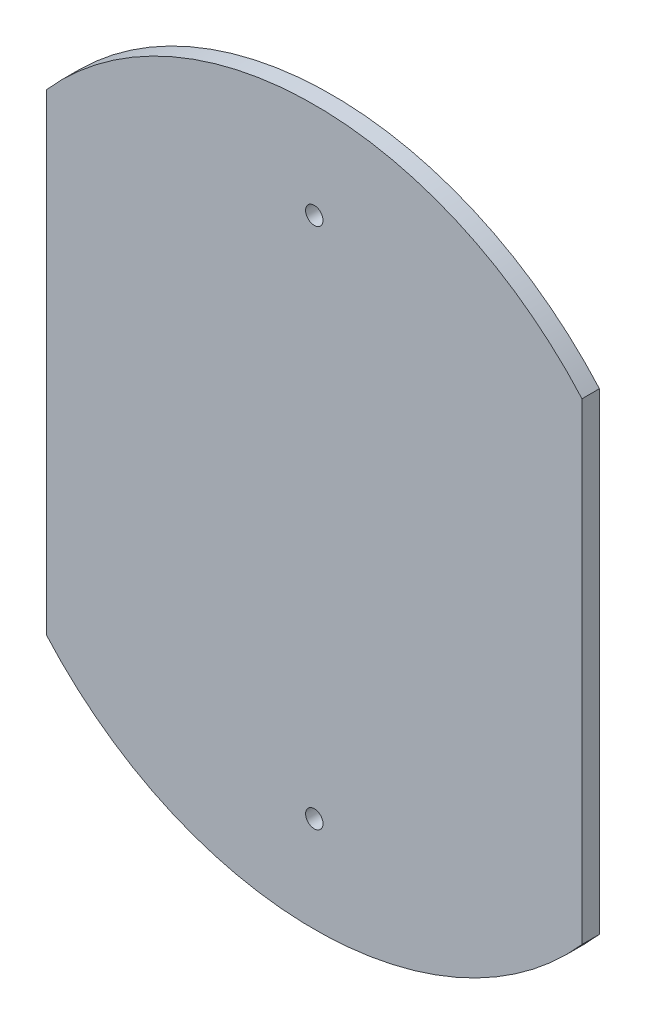
ISO-10303-21;
HEADER;
FILE_DESCRIPTION(('STEP AP214'),'2;1');
FILE_NAME('part.step','',(''),(''),'','','');
FILE_SCHEMA(('AUTOMOTIVE_DESIGN { 1 0 10303 214 1 1 1 1 }'));
ENDSEC;
DATA;
#1=APPLICATION_CONTEXT('core data for automotive mechanical design processes');
#2=APPLICATION_PROTOCOL_DEFINITION('international standard','automotive_design',2000,#1);
#3=PRODUCT_CONTEXT('',#1,'mechanical');
#4=PRODUCT('Part','Part','',(#3));
#5=PRODUCT_RELATED_PRODUCT_CATEGORY('part','',(#4));
#6=PRODUCT_DEFINITION_FORMATION('','',#4);
#7=PRODUCT_DEFINITION_CONTEXT('part definition',#1,'design');
#8=PRODUCT_DEFINITION('design','',#6,#7);
#9=PRODUCT_DEFINITION_SHAPE('','',#8);
#10=(LENGTH_UNIT() NAMED_UNIT(*) SI_UNIT(.MILLI.,.METRE.));
#11=(NAMED_UNIT(*) PLANE_ANGLE_UNIT() SI_UNIT($,.RADIAN.));
#12=(NAMED_UNIT(*) SI_UNIT($,.STERADIAN.) SOLID_ANGLE_UNIT());
#13=UNCERTAINTY_MEASURE_WITH_UNIT(LENGTH_MEASURE(1.E-05),#10,'distance_accuracy_value','');
#14=(GEOMETRIC_REPRESENTATION_CONTEXT(3) GLOBAL_UNCERTAINTY_ASSIGNED_CONTEXT((#13)) GLOBAL_UNIT_ASSIGNED_CONTEXT((#10,
#11,#12)) REPRESENTATION_CONTEXT('',''));
#15=CARTESIAN_POINT('',(0.,0.,0.));
#16=DIRECTION('',(0.,0.,1.));
#17=DIRECTION('',(1.,0.,0.));
#18=AXIS2_PLACEMENT_3D('',#15,#16,#17);
#19=CARTESIAN_POINT('',(0.,0.,4.));
#20=DIRECTION('',(0.,0.,-1.));
#21=DIRECTION('',(-1.,0.,0.));
#22=AXIS2_PLACEMENT_3D('',#19,#20,#21);
#23=CYLINDRICAL_SURFACE('',#22,82.);
#24=CARTESIAN_POINT('',(0.,0.,4.));
#25=DIRECTION('',(0.,0.,1.));
#26=DIRECTION('',(1.,0.,0.));
#27=AXIS2_PLACEMENT_3D('',#24,#25,#26);
#28=CIRCLE('',#27,82.);
#29=CARTESIAN_POINT('',(-61.4794501689973,-54.2611943005107,4.));
#30=VERTEX_POINT('',#29);
#31=CARTESIAN_POINT('',(61.4794501689973,-54.2611943005107,4.));
#32=VERTEX_POINT('',#31);
#33=EDGE_CURVE('E94',#30,#32,#28,.T.);
#34=ORIENTED_EDGE('',*,*,#33,.F.);
#35=DIRECTION('',(0.,0.,1.));
#36=VECTOR('',#35,1.);
#37=CARTESIAN_POINT('',(-61.4794501689973,-54.2611943005107,-6.));
#38=LINE('',#37,#36);
#39=CARTESIAN_POINT('',(-61.4794501689973,-54.2611943005107,0.));
#40=VERTEX_POINT('',#39);
#41=EDGE_CURVE('E72',#40,#30,#38,.T.);
#42=ORIENTED_EDGE('',*,*,#41,.F.);
#43=CARTESIAN_POINT('',(0.,0.,0.));
#44=DIRECTION('',(0.,0.,1.));
#45=DIRECTION('',(1.,0.,0.));
#46=AXIS2_PLACEMENT_3D('',#43,#44,#45);
#47=CIRCLE('',#46,82.);
#48=CARTESIAN_POINT('',(61.4794501689973,-54.2611943005107,0.));
#49=VERTEX_POINT('',#48);
#50=EDGE_CURVE('E95',#40,#49,#47,.T.);
#51=ORIENTED_EDGE('',*,*,#50,.T.);
#52=DIRECTION('',(0.,0.,1.));
#53=VECTOR('',#52,1.);
#54=CARTESIAN_POINT('',(61.4794501689973,-54.2611943005107,-6.));
#55=LINE('',#54,#53);
#56=EDGE_CURVE('E54',#49,#32,#55,.T.);
#57=ORIENTED_EDGE('',*,*,#56,.T.);
#58=EDGE_LOOP('',(#34,#42,#51,#57));
#59=FACE_BOUND('',#58,.T.);
#60=ADVANCED_FACE('F36',(#59),#23,.T.);
#61=CARTESIAN_POINT('',(61.4794501689973,54.2611943005107,0.));
#62=VERTEX_POINT('',#61);
#63=CARTESIAN_POINT('',(-61.4794501689973,54.2611943005107,0.));
#64=VERTEX_POINT('',#63);
#65=EDGE_CURVE('E90',#62,#64,#47,.T.);
#66=ORIENTED_EDGE('',*,*,#65,.T.);
#67=DIRECTION('',(0.,0.,1.));
#68=VECTOR('',#67,1.);
#69=CARTESIAN_POINT('',(-61.4794501689973,54.2611943005107,-6.));
#70=LINE('',#69,#68);
#71=CARTESIAN_POINT('',(-61.4794501689973,54.2611943005107,4.));
#72=VERTEX_POINT('',#71);
#73=EDGE_CURVE('E109',#64,#72,#70,.T.);
#74=ORIENTED_EDGE('',*,*,#73,.T.);
#75=CARTESIAN_POINT('',(61.4794501689973,54.2611943005107,4.));
#76=VERTEX_POINT('',#75);
#77=EDGE_CURVE('E83',#76,#72,#28,.T.);
#78=ORIENTED_EDGE('',*,*,#77,.F.);
#79=DIRECTION('',(0.,0.,1.));
#80=VECTOR('',#79,1.);
#81=CARTESIAN_POINT('',(61.4794501689973,54.2611943005107,-6.));
#82=LINE('',#81,#80);
#83=EDGE_CURVE('E77',#62,#76,#82,.T.);
#84=ORIENTED_EDGE('',*,*,#83,.F.);
#85=EDGE_LOOP('',(#66,#74,#78,#84));
#86=FACE_BOUND('',#85,.T.);
#87=ADVANCED_FACE('F88',(#86),#23,.T.);
#88=CARTESIAN_POINT('',(0.,0.,4.));
#89=DIRECTION('',(0.,0.,1.));
#90=DIRECTION('',(1.,0.,0.));
#91=AXIS2_PLACEMENT_3D('',#88,#89,#90);
#92=PLANE('',#91);
#93=DIRECTION('',(0.,1.,0.));
#94=VECTOR('',#93,1.);
#95=CARTESIAN_POINT('',(-61.4794501689973,0.,4.));
#96=LINE('',#95,#94);
#97=EDGE_CURVE('E39',#30,#72,#96,.T.);
#98=ORIENTED_EDGE('',*,*,#97,.F.);
#99=ORIENTED_EDGE('',*,*,#33,.T.);
#100=DIRECTION('',(0.,1.,0.));
#101=VECTOR('',#100,1.);
#102=CARTESIAN_POINT('',(61.4794501689973,0.,4.));
#103=LINE('',#102,#101);
#104=EDGE_CURVE('E108',#32,#76,#103,.T.);
#105=ORIENTED_EDGE('',*,*,#104,.T.);
#106=ORIENTED_EDGE('',*,*,#77,.T.);
#107=EDGE_LOOP('',(#98,#99,#105,#106));
#108=FACE_BOUND('',#107,.T.);
#109=CARTESIAN_POINT('',(0.,-60.,4.));
#110=DIRECTION('',(0.,0.,1.));
#111=DIRECTION('',(-1.,0.,0.));
#112=AXIS2_PLACEMENT_3D('',#109,#110,#111);
#113=CIRCLE('',#112,2.);
#114=CARTESIAN_POINT('',(-2.,-60.,4.));
#115=VERTEX_POINT('',#114);
#116=EDGE_CURVE('E107',#115,#115,#113,.T.);
#117=ORIENTED_EDGE('',*,*,#116,.F.);
#118=EDGE_LOOP('',(#117));
#119=FACE_BOUND('',#118,.T.);
#120=CARTESIAN_POINT('',(0.,60.,4.));
#121=DIRECTION('',(0.,0.,1.));
#122=DIRECTION('',(1.,0.,0.));
#123=AXIS2_PLACEMENT_3D('',#120,#121,#122);
#124=CIRCLE('',#123,2.);
#125=CARTESIAN_POINT('',(2.,60.,4.));
#126=VERTEX_POINT('',#125);
#127=EDGE_CURVE('E104',#126,#126,#124,.T.);
#128=ORIENTED_EDGE('',*,*,#127,.F.);
#129=EDGE_LOOP('',(#128));
#130=FACE_BOUND('',#129,.T.);
#131=ADVANCED_FACE('F122',(#108,#119,#130),#92,.T.);
#132=CARTESIAN_POINT('',(0.,0.,0.));
#133=DIRECTION('',(0.,0.,1.));
#134=DIRECTION('',(1.,0.,0.));
#135=AXIS2_PLACEMENT_3D('',#132,#133,#134);
#136=PLANE('',#135);
#137=CARTESIAN_POINT('',(0.,60.,0.));
#138=DIRECTION('',(0.,0.,1.));
#139=DIRECTION('',(1.,0.,0.));
#140=AXIS2_PLACEMENT_3D('',#137,#138,#139);
#141=CIRCLE('',#140,2.);
#142=CARTESIAN_POINT('',(2.,60.,0.));
#143=VERTEX_POINT('',#142);
#144=EDGE_CURVE('E99',#143,#143,#141,.T.);
#145=ORIENTED_EDGE('',*,*,#144,.T.);
#146=EDGE_LOOP('',(#145));
#147=FACE_BOUND('',#146,.T.);
#148=CARTESIAN_POINT('',(0.,-60.,0.));
#149=DIRECTION('',(0.,0.,1.));
#150=DIRECTION('',(1.,0.,0.));
#151=AXIS2_PLACEMENT_3D('',#148,#149,#150);
#152=CIRCLE('',#151,2.);
#153=CARTESIAN_POINT('',(2.,-60.,0.));
#154=VERTEX_POINT('',#153);
#155=EDGE_CURVE('E105',#154,#154,#152,.T.);
#156=ORIENTED_EDGE('',*,*,#155,.T.);
#157=EDGE_LOOP('',(#156));
#158=FACE_BOUND('',#157,.T.);
#159=ORIENTED_EDGE('',*,*,#50,.F.);
#160=DIRECTION('',(0.,1.,0.));
#161=VECTOR('',#160,1.);
#162=CARTESIAN_POINT('',(-61.4794501689973,0.,0.));
#163=LINE('',#162,#161);
#164=EDGE_CURVE('E11',#40,#64,#163,.T.);
#165=ORIENTED_EDGE('',*,*,#164,.T.);
#166=ORIENTED_EDGE('',*,*,#65,.F.);
#167=DIRECTION('',(0.,1.,0.));
#168=VECTOR('',#167,1.);
#169=CARTESIAN_POINT('',(61.4794501689973,0.,0.));
#170=LINE('',#169,#168);
#171=EDGE_CURVE('E45',#49,#62,#170,.T.);
#172=ORIENTED_EDGE('',*,*,#171,.F.);
#173=EDGE_LOOP('',(#159,#165,#166,#172));
#174=FACE_BOUND('',#173,.T.);
#175=ADVANCED_FACE('F93',(#147,#158,#174),#136,.F.);
#176=CARTESIAN_POINT('',(0.,60.,-4.));
#177=DIRECTION('',(0.,0.,1.));
#178=DIRECTION('',(1.,0.,0.));
#179=AXIS2_PLACEMENT_3D('',#176,#177,#178);
#180=CYLINDRICAL_SURFACE('',#179,2.);
#181=ORIENTED_EDGE('',*,*,#127,.T.);
#182=EDGE_LOOP('',(#181));
#183=FACE_BOUND('',#182,.T.);
#184=ORIENTED_EDGE('',*,*,#144,.F.);
#185=EDGE_LOOP('',(#184));
#186=FACE_BOUND('',#185,.T.);
#187=ADVANCED_FACE('F119',(#183,#186),#180,.F.);
#188=CARTESIAN_POINT('',(0.,-60.,-4.));
#189=DIRECTION('',(0.,0.,1.));
#190=DIRECTION('',(1.,0.,0.));
#191=AXIS2_PLACEMENT_3D('',#188,#189,#190);
#192=CYLINDRICAL_SURFACE('',#191,2.);
#193=ORIENTED_EDGE('',*,*,#116,.T.);
#194=EDGE_LOOP('',(#193));
#195=FACE_BOUND('',#194,.T.);
#196=ORIENTED_EDGE('',*,*,#155,.F.);
#197=EDGE_LOOP('',(#196));
#198=FACE_BOUND('',#197,.T.);
#199=ADVANCED_FACE('F143',(#195,#198),#192,.F.);
#200=CARTESIAN_POINT('',(61.4794501689973,0.,-6.));
#201=DIRECTION('',(1.,0.,0.));
#202=DIRECTION('',(0.,0.,-1.));
#203=AXIS2_PLACEMENT_3D('',#200,#201,#202);
#204=PLANE('',#203);
#205=ORIENTED_EDGE('',*,*,#56,.F.);
#206=ORIENTED_EDGE('',*,*,#171,.T.);
#207=ORIENTED_EDGE('',*,*,#83,.T.);
#208=ORIENTED_EDGE('',*,*,#104,.F.);
#209=EDGE_LOOP('',(#205,#206,#207,#208));
#210=FACE_BOUND('',#209,.T.);
#211=ADVANCED_FACE('F76',(#210),#204,.T.);
#212=CARTESIAN_POINT('',(-61.4794501689973,0.,-6.));
#213=DIRECTION('',(1.,0.,0.));
#214=DIRECTION('',(0.,0.,-1.));
#215=AXIS2_PLACEMENT_3D('',#212,#213,#214);
#216=PLANE('',#215);
#217=ORIENTED_EDGE('',*,*,#97,.T.);
#218=ORIENTED_EDGE('',*,*,#73,.F.);
#219=ORIENTED_EDGE('',*,*,#164,.F.);
#220=ORIENTED_EDGE('',*,*,#41,.T.);
#221=EDGE_LOOP('',(#217,#218,#219,#220));
#222=FACE_BOUND('',#221,.T.);
#223=ADVANCED_FACE('F137',(#222),#216,.F.);
#224=CLOSED_SHELL('',(#60,#87,#131,#175,#187,#199,#211,#223));
#225=MANIFOLD_SOLID_BREP('B2',#224);
#226=ADVANCED_BREP_SHAPE_REPRESENTATION('',(#18,#225),#14);
#227=SHAPE_DEFINITION_REPRESENTATION(#9,#226);
ENDSEC;
END-ISO-10303-21;
